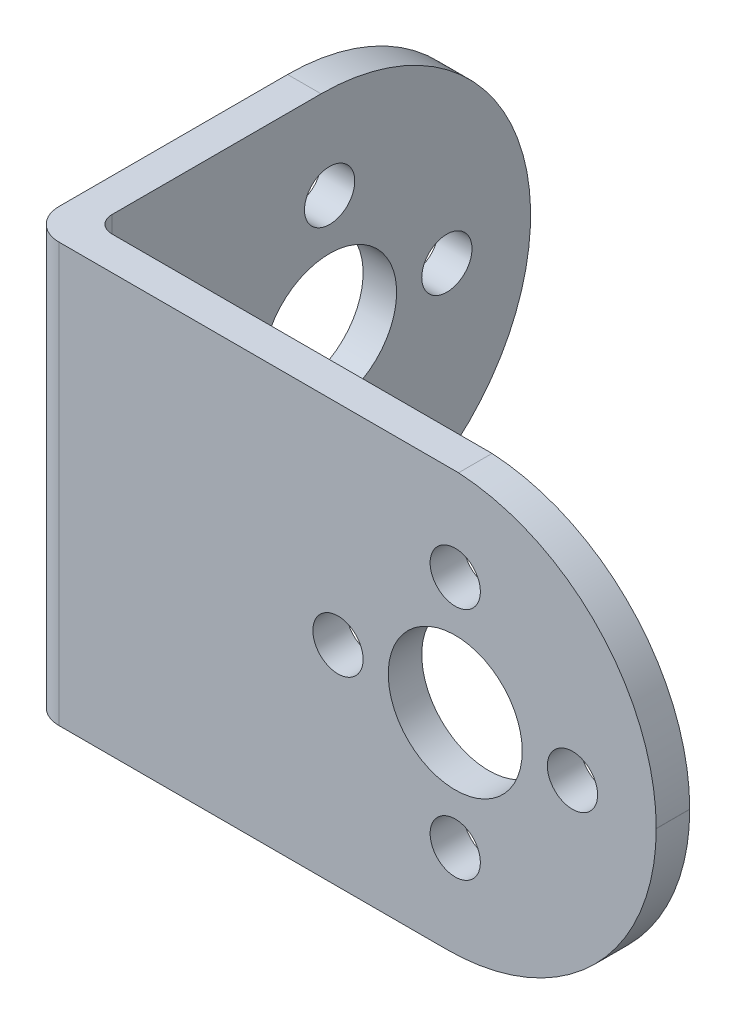
ISO-10303-21;
HEADER;
FILE_DESCRIPTION(('STEP AP214'),'2;1');
FILE_NAME('part.step','',(''),(''),'','','');
FILE_SCHEMA(('AUTOMOTIVE_DESIGN { 1 0 10303 214 1 1 1 1 }'));
ENDSEC;
DATA;
#1=APPLICATION_CONTEXT('core data for automotive mechanical design processes');
#2=APPLICATION_PROTOCOL_DEFINITION('international standard','automotive_design',2000,#1);
#3=PRODUCT_CONTEXT('',#1,'mechanical');
#4=PRODUCT('Part','Part','',(#3));
#5=PRODUCT_RELATED_PRODUCT_CATEGORY('part','',(#4));
#6=PRODUCT_DEFINITION_FORMATION('','',#4);
#7=PRODUCT_DEFINITION_CONTEXT('part definition',#1,'design');
#8=PRODUCT_DEFINITION('design','',#6,#7);
#9=PRODUCT_DEFINITION_SHAPE('','',#8);
#10=(LENGTH_UNIT() NAMED_UNIT(*) SI_UNIT(.MILLI.,.METRE.));
#11=(NAMED_UNIT(*) PLANE_ANGLE_UNIT() SI_UNIT($,.RADIAN.));
#12=(NAMED_UNIT(*) SI_UNIT($,.STERADIAN.) SOLID_ANGLE_UNIT());
#13=UNCERTAINTY_MEASURE_WITH_UNIT(LENGTH_MEASURE(1.E-05),#10,'distance_accuracy_value','');
#14=(GEOMETRIC_REPRESENTATION_CONTEXT(3) GLOBAL_UNCERTAINTY_ASSIGNED_CONTEXT((#13)) GLOBAL_UNIT_ASSIGNED_CONTEXT((#10,
#11,#12)) REPRESENTATION_CONTEXT('',''));
#15=CARTESIAN_POINT('',(0.,0.,0.));
#16=DIRECTION('',(0.,0.,1.));
#17=DIRECTION('',(1.,0.,0.));
#18=AXIS2_PLACEMENT_3D('',#15,#16,#17);
#19=CARTESIAN_POINT('',(37.5,25.,-2.));
#20=DIRECTION('',(-1.,0.,0.));
#21=DIRECTION('',(0.,0.,1.));
#22=AXIS2_PLACEMENT_3D('',#19,#20,#21);
#23=PLANE('',#22);
#24=CARTESIAN_POINT('',(37.4999960031981,12.5000000015974,-2.));
#25=DIRECTION('',(0.,0.,1.));
#26=VECTOR('',#25,1.);
#27=LINE('',#24,#26);
#28=CARTESIAN_POINT('',(37.499998001599,12.5000000007987,-2.));
#29=VERTEX_POINT('',#28);
#30=CARTESIAN_POINT('',(37.4999980015984,12.5,0.));
#31=VERTEX_POINT('',#30);
#32=EDGE_CURVE('E286',#29,#31,#27,.T.);
#33=ORIENTED_EDGE('',*,*,#32,.F.);
#34=DIRECTION('',(0.,-1.,0.));
#35=VECTOR('',#34,1.);
#36=CARTESIAN_POINT('',(37.5,25.,-2.));
#37=LINE('',#36,#35);
#38=CARTESIAN_POINT('',(37.5,12.51,-2.));
#39=VERTEX_POINT('',#38);
#40=EDGE_CURVE('E328',#39,#29,#37,.T.);
#41=ORIENTED_EDGE('',*,*,#40,.F.);
#42=DIRECTION('',(0.,0.,1.));
#43=VECTOR('',#42,1.);
#44=CARTESIAN_POINT('',(37.5,12.51,-25.));
#45=LINE('',#44,#43);
#46=CARTESIAN_POINT('',(37.5,12.51,0.));
#47=VERTEX_POINT('',#46);
#48=EDGE_CURVE('E224',#39,#47,#45,.T.);
#49=ORIENTED_EDGE('',*,*,#48,.T.);
#50=DIRECTION('',(0.,-1.,0.));
#51=VECTOR('',#50,1.);
#52=CARTESIAN_POINT('',(37.5,25.,0.));
#53=LINE('',#52,#51);
#54=EDGE_CURVE('E337',#47,#31,#53,.T.);
#55=ORIENTED_EDGE('',*,*,#54,.T.);
#56=EDGE_LOOP('',(#33,#41,#49,#55));
#57=FACE_BOUND('',#56,.T.);
#58=ADVANCED_FACE('F205',(#57),#23,.F.);
#59=CARTESIAN_POINT('',(3.,25.,-3.));
#60=DIRECTION('',(0.,1.,0.));
#61=DIRECTION('',(0.,0.,1.));
#62=AXIS2_PLACEMENT_3D('',#59,#60,#61);
#63=PLANE('',#62);
#64=DIRECTION('',(1.,0.,0.));
#65=VECTOR('',#64,1.);
#66=CARTESIAN_POINT('',(37.5,25.,0.));
#67=LINE('',#66,#65);
#68=CARTESIAN_POINT('',(1.84,25.,0.));
#69=VERTEX_POINT('',#68);
#70=CARTESIAN_POINT('',(25.6971067811866,25.,0.));
#71=VERTEX_POINT('',#70);
#72=EDGE_CURVE('E375',#69,#71,#67,.T.);
#73=ORIENTED_EDGE('',*,*,#72,.T.);
#74=DIRECTION('',(0.,0.,1.));
#75=VECTOR('',#74,1.);
#76=CARTESIAN_POINT('',(25.6971067811866,25.,-25.));
#77=LINE('',#76,#75);
#78=CARTESIAN_POINT('',(25.6971067811866,25.,-2.));
#79=VERTEX_POINT('',#78);
#80=EDGE_CURVE('E346',#79,#71,#77,.T.);
#81=ORIENTED_EDGE('',*,*,#80,.F.);
#82=DIRECTION('',(-1.,0.,0.));
#83=VECTOR('',#82,1.);
#84=CARTESIAN_POINT('',(3.00000000000001,25.,-2.));
#85=LINE('',#84,#83);
#86=CARTESIAN_POINT('',(3.00000000000001,25.,-2.));
#87=VERTEX_POINT('',#86);
#88=EDGE_CURVE('E368',#79,#87,#85,.T.);
#89=ORIENTED_EDGE('',*,*,#88,.T.);
#90=CARTESIAN_POINT('',(3.,25.,-3.));
#91=DIRECTION('',(0.,-1.,0.));
#92=DIRECTION('',(0.,0.,1.));
#93=AXIS2_PLACEMENT_3D('',#90,#91,#92);
#94=CIRCLE('',#93,1.);
#95=CARTESIAN_POINT('',(2.,25.,-3.00000000000001));
#96=VERTEX_POINT('',#95);
#97=EDGE_CURVE('E465',#87,#96,#94,.T.);
#98=ORIENTED_EDGE('',*,*,#97,.T.);
#99=DIRECTION('',(0.,0.,-1.));
#100=VECTOR('',#99,1.);
#101=CARTESIAN_POINT('',(2.,25.,-28.));
#102=LINE('',#101,#100);
#103=CARTESIAN_POINT('',(2.,25.,-15.49));
#104=VERTEX_POINT('',#103);
#105=EDGE_CURVE('E325',#96,#104,#102,.T.);
#106=ORIENTED_EDGE('',*,*,#105,.T.);
#107=DIRECTION('',(-1.,0.,0.));
#108=VECTOR('',#107,1.);
#109=CARTESIAN_POINT('',(25.,25.,-15.49));
#110=LINE('',#109,#108);
#111=CARTESIAN_POINT('',(0.,25.,-15.49));
#112=VERTEX_POINT('',#111);
#113=EDGE_CURVE('E499',#104,#112,#110,.T.);
#114=ORIENTED_EDGE('',*,*,#113,.T.);
#115=DIRECTION('',(0.,0.,1.));
#116=VECTOR('',#115,1.);
#117=CARTESIAN_POINT('',(0.,25.,-1.84000000000001));
#118=LINE('',#117,#116);
#119=CARTESIAN_POINT('',(0.,25.,-1.84000000000001));
#120=VERTEX_POINT('',#119);
#121=EDGE_CURVE('E320',#112,#120,#118,.T.);
#122=ORIENTED_EDGE('',*,*,#121,.T.);
#123=CARTESIAN_POINT('',(1.84,25.,-1.84));
#124=DIRECTION('',(0.,1.,0.));
#125=DIRECTION('',(0.,0.,1.));
#126=AXIS2_PLACEMENT_3D('',#123,#124,#125);
#127=CIRCLE('',#126,1.84);
#128=EDGE_CURVE('E469',#120,#69,#127,.T.);
#129=ORIENTED_EDGE('',*,*,#128,.T.);
#130=EDGE_LOOP('',(#73,#81,#89,#98,#106,#114,#122,#129));
#131=FACE_BOUND('',#130,.T.);
#132=ADVANCED_FACE('F374',(#131),#63,.T.);
#133=CARTESIAN_POINT('',(37.5,25.,0.));
#134=DIRECTION('',(0.,0.,-1.));
#135=DIRECTION('',(-1.,0.,0.));
#136=AXIS2_PLACEMENT_3D('',#133,#134,#135);
#137=PLANE('',#136);
#138=CARTESIAN_POINT('',(32.5,12.5,0.));
#139=DIRECTION('',(0.,0.,1.));
#140=DIRECTION('',(1.,0.,0.));
#141=AXIS2_PLACEMENT_3D('',#138,#139,#140);
#142=CIRCLE('',#141,1.5);
#143=CARTESIAN_POINT('',(34.,12.5,0.));
#144=VERTEX_POINT('',#143);
#145=EDGE_CURVE('E657',#144,#144,#142,.T.);
#146=ORIENTED_EDGE('',*,*,#145,.F.);
#147=EDGE_LOOP('',(#146));
#148=FACE_BOUND('',#147,.T.);
#149=CARTESIAN_POINT('',(25.5,12.5,0.));
#150=DIRECTION('',(0.,0.,1.));
#151=DIRECTION('',(1.,0.,0.));
#152=AXIS2_PLACEMENT_3D('',#149,#150,#151);
#153=CIRCLE('',#152,4.);
#154=CARTESIAN_POINT('',(29.5,12.5,0.));
#155=VERTEX_POINT('',#154);
#156=EDGE_CURVE('E671',#155,#155,#153,.T.);
#157=ORIENTED_EDGE('',*,*,#156,.F.);
#158=EDGE_LOOP('',(#157));
#159=FACE_BOUND('',#158,.T.);
#160=CARTESIAN_POINT('',(18.5,12.5,0.));
#161=DIRECTION('',(0.,0.,1.));
#162=DIRECTION('',(1.,0.,0.));
#163=AXIS2_PLACEMENT_3D('',#160,#161,#162);
#164=CIRCLE('',#163,1.5);
#165=CARTESIAN_POINT('',(20.,12.5,0.));
#166=VERTEX_POINT('',#165);
#167=EDGE_CURVE('E677',#166,#166,#164,.T.);
#168=ORIENTED_EDGE('',*,*,#167,.F.);
#169=EDGE_LOOP('',(#168));
#170=FACE_BOUND('',#169,.T.);
#171=CARTESIAN_POINT('',(25.5,19.5,0.));
#172=DIRECTION('',(0.,0.,1.));
#173=DIRECTION('',(1.,0.,0.));
#174=AXIS2_PLACEMENT_3D('',#171,#172,#173);
#175=CIRCLE('',#174,1.5);
#176=CARTESIAN_POINT('',(27.,19.5,0.));
#177=VERTEX_POINT('',#176);
#178=EDGE_CURVE('E672',#177,#177,#175,.T.);
#179=ORIENTED_EDGE('',*,*,#178,.F.);
#180=EDGE_LOOP('',(#179));
#181=FACE_BOUND('',#180,.T.);
#182=CARTESIAN_POINT('',(25.5,5.5,0.));
#183=DIRECTION('',(0.,0.,1.));
#184=DIRECTION('',(1.,0.,0.));
#185=AXIS2_PLACEMENT_3D('',#182,#183,#184);
#186=CIRCLE('',#185,1.5);
#187=CARTESIAN_POINT('',(27.,5.5,0.));
#188=VERTEX_POINT('',#187);
#189=EDGE_CURVE('E292',#188,#188,#186,.T.);
#190=ORIENTED_EDGE('',*,*,#189,.F.);
#191=EDGE_LOOP('',(#190));
#192=FACE_BOUND('',#191,.T.);
#193=CARTESIAN_POINT('',(24.99,12.51,0.));
#194=DIRECTION('',(0.,0.,1.));
#195=DIRECTION('',(1.,0.,0.));
#196=AXIS2_PLACEMENT_3D('',#193,#194,#195);
#197=CIRCLE('',#196,12.51);
#198=CARTESIAN_POINT('',(24.99,0.,0.));
#199=VERTEX_POINT('',#198);
#200=EDGE_CURVE('E283',#199,#31,#197,.T.);
#201=ORIENTED_EDGE('',*,*,#200,.T.);
#202=ORIENTED_EDGE('',*,*,#54,.F.);
#203=CARTESIAN_POINT('',(24.99,12.51,0.));
#204=DIRECTION('',(0.,0.,1.));
#205=DIRECTION('',(1.,0.,0.));
#206=AXIS2_PLACEMENT_3D('',#203,#204,#205);
#207=CIRCLE('',#206,12.51);
#208=EDGE_CURVE('E363',#47,#71,#207,.T.);
#209=ORIENTED_EDGE('',*,*,#208,.T.);
#210=ORIENTED_EDGE('',*,*,#72,.F.);
#211=DIRECTION('',(0.,-1.,0.));
#212=VECTOR('',#211,1.);
#213=CARTESIAN_POINT('',(1.84,25.,0.));
#214=LINE('',#213,#212);
#215=CARTESIAN_POINT('',(1.84,0.,0.));
#216=VERTEX_POINT('',#215);
#217=EDGE_CURVE('E307',#69,#216,#214,.T.);
#218=ORIENTED_EDGE('',*,*,#217,.T.);
#219=DIRECTION('',(1.,0.,0.));
#220=VECTOR('',#219,1.);
#221=CARTESIAN_POINT('',(37.5,0.,0.));
#222=LINE('',#221,#220);
#223=EDGE_CURVE('E299',#216,#199,#222,.T.);
#224=ORIENTED_EDGE('',*,*,#223,.T.);
#225=EDGE_LOOP('',(#201,#202,#209,#210,#218,#224));
#226=FACE_BOUND('',#225,.T.);
#227=ADVANCED_FACE('F304',(#148,#159,#170,#181,#192,#226),#137,.F.);
#228=CARTESIAN_POINT('',(3.00000000000001,25.,-2.));
#229=DIRECTION('',(0.,0.,1.));
#230=DIRECTION('',(1.,0.,0.));
#231=AXIS2_PLACEMENT_3D('',#228,#229,#230);
#232=PLANE('',#231);
#233=CARTESIAN_POINT('',(32.5,12.5,-2.00000000000001));
#234=DIRECTION('',(0.,0.,1.));
#235=DIRECTION('',(1.,0.,0.));
#236=AXIS2_PLACEMENT_3D('',#233,#234,#235);
#237=CIRCLE('',#236,1.5);
#238=CARTESIAN_POINT('',(34.,12.5,-2.00000000000001));
#239=VERTEX_POINT('',#238);
#240=EDGE_CURVE('E357',#239,#239,#237,.T.);
#241=ORIENTED_EDGE('',*,*,#240,.T.);
#242=EDGE_LOOP('',(#241));
#243=FACE_BOUND('',#242,.T.);
#244=CARTESIAN_POINT('',(25.5,12.5,-2.00000000000001));
#245=DIRECTION('',(0.,0.,1.));
#246=DIRECTION('',(1.,0.,0.));
#247=AXIS2_PLACEMENT_3D('',#244,#245,#246);
#248=CIRCLE('',#247,4.);
#249=CARTESIAN_POINT('',(29.5,12.5,-2.00000000000001));
#250=VERTEX_POINT('',#249);
#251=EDGE_CURVE('E351',#250,#250,#248,.T.);
#252=ORIENTED_EDGE('',*,*,#251,.T.);
#253=EDGE_LOOP('',(#252));
#254=FACE_BOUND('',#253,.T.);
#255=CARTESIAN_POINT('',(18.5,12.5,-2.));
#256=DIRECTION('',(0.,0.,1.));
#257=DIRECTION('',(1.,0.,0.));
#258=AXIS2_PLACEMENT_3D('',#255,#256,#257);
#259=CIRCLE('',#258,1.5);
#260=CARTESIAN_POINT('',(20.,12.5,-2.));
#261=VERTEX_POINT('',#260);
#262=EDGE_CURVE('E342',#261,#261,#259,.T.);
#263=ORIENTED_EDGE('',*,*,#262,.T.);
#264=EDGE_LOOP('',(#263));
#265=FACE_BOUND('',#264,.T.);
#266=CARTESIAN_POINT('',(25.5,19.5,-2.00000000000001));
#267=DIRECTION('',(0.,0.,1.));
#268=DIRECTION('',(1.,0.,0.));
#269=AXIS2_PLACEMENT_3D('',#266,#267,#268);
#270=CIRCLE('',#269,1.5);
#271=CARTESIAN_POINT('',(27.,19.5,-2.00000000000001));
#272=VERTEX_POINT('',#271);
#273=EDGE_CURVE('E345',#272,#272,#270,.T.);
#274=ORIENTED_EDGE('',*,*,#273,.T.);
#275=EDGE_LOOP('',(#274));
#276=FACE_BOUND('',#275,.T.);
#277=CARTESIAN_POINT('',(25.5,5.5,-2.00000000000001));
#278=DIRECTION('',(0.,0.,1.));
#279=DIRECTION('',(1.,0.,0.));
#280=AXIS2_PLACEMENT_3D('',#277,#278,#279);
#281=CIRCLE('',#280,1.5);
#282=CARTESIAN_POINT('',(27.,5.5,-2.00000000000001));
#283=VERTEX_POINT('',#282);
#284=EDGE_CURVE('E349',#283,#283,#281,.T.);
#285=ORIENTED_EDGE('',*,*,#284,.T.);
#286=EDGE_LOOP('',(#285));
#287=FACE_BOUND('',#286,.T.);
#288=CARTESIAN_POINT('',(24.99,12.51,-2.00000000000001));
#289=DIRECTION('',(0.,0.,1.));
#290=DIRECTION('',(1.,0.,0.));
#291=AXIS2_PLACEMENT_3D('',#288,#289,#290);
#292=CIRCLE('',#291,12.51);
#293=CARTESIAN_POINT('',(24.99,0.,-2.));
#294=VERTEX_POINT('',#293);
#295=EDGE_CURVE('E12',#294,#29,#292,.T.);
#296=ORIENTED_EDGE('',*,*,#295,.F.);
#297=DIRECTION('',(-1.,0.,0.));
#298=VECTOR('',#297,1.);
#299=CARTESIAN_POINT('',(3.00000000000001,0.,-2.));
#300=LINE('',#299,#298);
#301=CARTESIAN_POINT('',(3.00000000000001,0.,-2.));
#302=VERTEX_POINT('',#301);
#303=EDGE_CURVE('E301',#294,#302,#300,.T.);
#304=ORIENTED_EDGE('',*,*,#303,.T.);
#305=DIRECTION('',(0.,-1.,0.));
#306=VECTOR('',#305,1.);
#307=CARTESIAN_POINT('',(3.00000000000001,25.,-2.));
#308=LINE('',#307,#306);
#309=EDGE_CURVE('E324',#87,#302,#308,.T.);
#310=ORIENTED_EDGE('',*,*,#309,.F.);
#311=ORIENTED_EDGE('',*,*,#88,.F.);
#312=CARTESIAN_POINT('',(24.99,12.51,-2.00000000000001));
#313=DIRECTION('',(0.,0.,1.));
#314=DIRECTION('',(1.,0.,0.));
#315=AXIS2_PLACEMENT_3D('',#312,#313,#314);
#316=CIRCLE('',#315,12.51);
#317=EDGE_CURVE('E216',#39,#79,#316,.T.);
#318=ORIENTED_EDGE('',*,*,#317,.F.);
#319=ORIENTED_EDGE('',*,*,#40,.T.);
#320=EDGE_LOOP('',(#296,#304,#310,#311,#318,#319));
#321=FACE_BOUND('',#320,.T.);
#322=ADVANCED_FACE('F365',(#243,#254,#265,#276,#287,#321),#232,.F.);
#323=CARTESIAN_POINT('',(0.,25.,-1.84000000000001));
#324=DIRECTION('',(1.,0.,0.));
#325=DIRECTION('',(0.,0.,-1.));
#326=AXIS2_PLACEMENT_3D('',#323,#324,#325);
#327=PLANE('',#326);
#328=CARTESIAN_POINT('',(0.,19.49,-16.));
#329=DIRECTION('',(-1.,0.,0.));
#330=DIRECTION('',(0.,0.,1.));
#331=AXIS2_PLACEMENT_3D('',#328,#329,#330);
#332=CIRCLE('',#331,1.5);
#333=CARTESIAN_POINT('',(0.,19.49,-14.5));
#334=VERTEX_POINT('',#333);
#335=EDGE_CURVE('E360',#334,#334,#332,.T.);
#336=ORIENTED_EDGE('',*,*,#335,.F.);
#337=EDGE_LOOP('',(#336));
#338=FACE_BOUND('',#337,.T.);
#339=CARTESIAN_POINT('',(0.,12.49,-9.));
#340=DIRECTION('',(-1.,0.,0.));
#341=DIRECTION('',(0.,0.,1.));
#342=AXIS2_PLACEMENT_3D('',#339,#340,#341);
#343=CIRCLE('',#342,1.5);
#344=CARTESIAN_POINT('',(0.,12.49,-7.5));
#345=VERTEX_POINT('',#344);
#346=EDGE_CURVE('E381',#345,#345,#343,.T.);
#347=ORIENTED_EDGE('',*,*,#346,.F.);
#348=EDGE_LOOP('',(#347));
#349=FACE_BOUND('',#348,.T.);
#350=CARTESIAN_POINT('',(0.,12.49,-16.));
#351=DIRECTION('',(-1.,0.,0.));
#352=DIRECTION('',(0.,0.,1.));
#353=AXIS2_PLACEMENT_3D('',#350,#351,#352);
#354=CIRCLE('',#353,4.);
#355=CARTESIAN_POINT('',(0.,12.49,-12.));
#356=VERTEX_POINT('',#355);
#357=EDGE_CURVE('E473',#356,#356,#354,.T.);
#358=ORIENTED_EDGE('',*,*,#357,.F.);
#359=EDGE_LOOP('',(#358));
#360=FACE_BOUND('',#359,.T.);
#361=CARTESIAN_POINT('',(0.,5.49,-16.));
#362=DIRECTION('',(-1.,0.,0.));
#363=DIRECTION('',(0.,0.,1.));
#364=AXIS2_PLACEMENT_3D('',#361,#362,#363);
#365=CIRCLE('',#364,1.5);
#366=CARTESIAN_POINT('',(0.,5.49,-14.5));
#367=VERTEX_POINT('',#366);
#368=EDGE_CURVE('E478',#367,#367,#365,.T.);
#369=ORIENTED_EDGE('',*,*,#368,.F.);
#370=EDGE_LOOP('',(#369));
#371=FACE_BOUND('',#370,.T.);
#372=CARTESIAN_POINT('',(0.,12.49,-23.));
#373=DIRECTION('',(-1.,0.,0.));
#374=DIRECTION('',(0.,0.,1.));
#375=AXIS2_PLACEMENT_3D('',#372,#373,#374);
#376=CIRCLE('',#375,1.5);
#377=CARTESIAN_POINT('',(0.,12.49,-21.5));
#378=VERTEX_POINT('',#377);
#379=EDGE_CURVE('E477',#378,#378,#376,.T.);
#380=ORIENTED_EDGE('',*,*,#379,.F.);
#381=EDGE_LOOP('',(#380));
#382=FACE_BOUND('',#381,.T.);
#383=CARTESIAN_POINT('',(0.,12.49,-15.49));
#384=DIRECTION('',(-1.,0.,0.));
#385=DIRECTION('',(0.,0.,1.));
#386=AXIS2_PLACEMENT_3D('',#383,#384,#385);
#387=CIRCLE('',#386,12.51);
#388=CARTESIAN_POINT('',(0.,0.,-16.1971067811865));
#389=VERTEX_POINT('',#388);
#390=EDGE_CURVE('E460',#112,#389,#387,.T.);
#391=ORIENTED_EDGE('',*,*,#390,.T.);
#392=DIRECTION('',(0.,0.,1.));
#393=VECTOR('',#392,1.);
#394=CARTESIAN_POINT('',(0.,0.,-1.84000000000001));
#395=LINE('',#394,#393);
#396=CARTESIAN_POINT('',(0.,0.,-1.84000000000001));
#397=VERTEX_POINT('',#396);
#398=EDGE_CURVE('E312',#389,#397,#395,.T.);
#399=ORIENTED_EDGE('',*,*,#398,.T.);
#400=DIRECTION('',(0.,-1.,0.));
#401=VECTOR('',#400,1.);
#402=CARTESIAN_POINT('',(0.,25.,-1.84000000000001));
#403=LINE('',#402,#401);
#404=EDGE_CURVE('E453',#120,#397,#403,.T.);
#405=ORIENTED_EDGE('',*,*,#404,.F.);
#406=ORIENTED_EDGE('',*,*,#121,.F.);
#407=EDGE_LOOP('',(#391,#399,#405,#406));
#408=FACE_BOUND('',#407,.T.);
#409=ADVANCED_FACE('F207',(#338,#349,#360,#371,#382,#408),#327,.F.);
#410=CARTESIAN_POINT('',(2.,25.,-28.));
#411=DIRECTION('',(-1.,0.,0.));
#412=DIRECTION('',(0.,0.,1.));
#413=AXIS2_PLACEMENT_3D('',#410,#411,#412);
#414=PLANE('',#413);
#415=CARTESIAN_POINT('',(2.,19.49,-16.));
#416=DIRECTION('',(-1.,0.,0.));
#417=DIRECTION('',(0.,0.,1.));
#418=AXIS2_PLACEMENT_3D('',#415,#416,#417);
#419=CIRCLE('',#418,1.5);
#420=CARTESIAN_POINT('',(2.,19.49,-14.5));
#421=VERTEX_POINT('',#420);
#422=EDGE_CURVE('E338',#421,#421,#419,.T.);
#423=ORIENTED_EDGE('',*,*,#422,.T.);
#424=EDGE_LOOP('',(#423));
#425=FACE_BOUND('',#424,.T.);
#426=CARTESIAN_POINT('',(2.,12.49,-9.));
#427=DIRECTION('',(-1.,0.,0.));
#428=DIRECTION('',(0.,0.,1.));
#429=AXIS2_PLACEMENT_3D('',#426,#427,#428);
#430=CIRCLE('',#429,1.5);
#431=CARTESIAN_POINT('',(2.,12.49,-7.5));
#432=VERTEX_POINT('',#431);
#433=EDGE_CURVE('E511',#432,#432,#430,.T.);
#434=ORIENTED_EDGE('',*,*,#433,.T.);
#435=EDGE_LOOP('',(#434));
#436=FACE_BOUND('',#435,.T.);
#437=CARTESIAN_POINT('',(2.,12.49,-16.));
#438=DIRECTION('',(-1.,0.,0.));
#439=DIRECTION('',(0.,0.,1.));
#440=AXIS2_PLACEMENT_3D('',#437,#438,#439);
#441=CIRCLE('',#440,4.);
#442=CARTESIAN_POINT('',(2.,12.49,-12.));
#443=VERTEX_POINT('',#442);
#444=EDGE_CURVE('E509',#443,#443,#441,.T.);
#445=ORIENTED_EDGE('',*,*,#444,.T.);
#446=EDGE_LOOP('',(#445));
#447=FACE_BOUND('',#446,.T.);
#448=CARTESIAN_POINT('',(2.,5.49,-16.));
#449=DIRECTION('',(-1.,0.,0.));
#450=DIRECTION('',(0.,0.,1.));
#451=AXIS2_PLACEMENT_3D('',#448,#449,#450);
#452=CIRCLE('',#451,1.5);
#453=CARTESIAN_POINT('',(2.,5.49,-14.5));
#454=VERTEX_POINT('',#453);
#455=EDGE_CURVE('E476',#454,#454,#452,.T.);
#456=ORIENTED_EDGE('',*,*,#455,.T.);
#457=EDGE_LOOP('',(#456));
#458=FACE_BOUND('',#457,.T.);
#459=CARTESIAN_POINT('',(2.,12.49,-23.));
#460=DIRECTION('',(-1.,0.,0.));
#461=DIRECTION('',(0.,0.,1.));
#462=AXIS2_PLACEMENT_3D('',#459,#460,#461);
#463=CIRCLE('',#462,1.5);
#464=CARTESIAN_POINT('',(2.,12.49,-21.5));
#465=VERTEX_POINT('',#464);
#466=EDGE_CURVE('E506',#465,#465,#463,.T.);
#467=ORIENTED_EDGE('',*,*,#466,.T.);
#468=EDGE_LOOP('',(#467));
#469=FACE_BOUND('',#468,.T.);
#470=DIRECTION('',(0.,0.,-1.));
#471=VECTOR('',#470,1.);
#472=CARTESIAN_POINT('',(2.,0.,-28.));
#473=LINE('',#472,#471);
#474=CARTESIAN_POINT('',(2.,0.,-3.00000000000001));
#475=VERTEX_POINT('',#474);
#476=CARTESIAN_POINT('',(2.,0.,-16.1971067811865));
#477=VERTEX_POINT('',#476);
#478=EDGE_CURVE('E317',#475,#477,#473,.T.);
#479=ORIENTED_EDGE('',*,*,#478,.T.);
#480=CARTESIAN_POINT('',(2.,12.49,-15.49));
#481=DIRECTION('',(-1.,0.,0.));
#482=DIRECTION('',(0.,0.,1.));
#483=AXIS2_PLACEMENT_3D('',#480,#481,#482);
#484=CIRCLE('',#483,12.51);
#485=EDGE_CURVE('E459',#104,#477,#484,.T.);
#486=ORIENTED_EDGE('',*,*,#485,.F.);
#487=ORIENTED_EDGE('',*,*,#105,.F.);
#488=DIRECTION('',(0.,-1.,0.));
#489=VECTOR('',#488,1.);
#490=CARTESIAN_POINT('',(2.,25.,-3.00000000000001));
#491=LINE('',#490,#489);
#492=EDGE_CURVE('E321',#96,#475,#491,.T.);
#493=ORIENTED_EDGE('',*,*,#492,.T.);
#494=EDGE_LOOP('',(#479,#486,#487,#493));
#495=FACE_BOUND('',#494,.T.);
#496=ADVANCED_FACE('F432',(#425,#436,#447,#458,#469,#495),#414,.F.);
#497=CARTESIAN_POINT('',(3.,0.,-3.));
#498=DIRECTION('',(0.,1.,0.));
#499=DIRECTION('',(0.,0.,1.));
#500=AXIS2_PLACEMENT_3D('',#497,#498,#499);
#501=PLANE('',#500);
#502=ORIENTED_EDGE('',*,*,#303,.F.);
#503=DIRECTION('',(0.,0.,1.));
#504=VECTOR('',#503,1.);
#505=CARTESIAN_POINT('',(24.99,0.,-25.));
#506=LINE('',#505,#504);
#507=EDGE_CURVE('E231',#294,#199,#506,.T.);
#508=ORIENTED_EDGE('',*,*,#507,.T.);
#509=ORIENTED_EDGE('',*,*,#223,.F.);
#510=CARTESIAN_POINT('',(1.84,0.,-1.84));
#511=DIRECTION('',(0.,1.,0.));
#512=DIRECTION('',(0.,0.,1.));
#513=AXIS2_PLACEMENT_3D('',#510,#511,#512);
#514=CIRCLE('',#513,1.84);
#515=EDGE_CURVE('E308',#397,#216,#514,.T.);
#516=ORIENTED_EDGE('',*,*,#515,.F.);
#517=ORIENTED_EDGE('',*,*,#398,.F.);
#518=DIRECTION('',(-1.,0.,0.));
#519=VECTOR('',#518,1.);
#520=CARTESIAN_POINT('',(25.,0.,-16.1971067811865));
#521=LINE('',#520,#519);
#522=EDGE_CURVE('E341',#477,#389,#521,.T.);
#523=ORIENTED_EDGE('',*,*,#522,.F.);
#524=ORIENTED_EDGE('',*,*,#478,.F.);
#525=CARTESIAN_POINT('',(3.,0.,-3.));
#526=DIRECTION('',(0.,-1.,0.));
#527=DIRECTION('',(0.,0.,1.));
#528=AXIS2_PLACEMENT_3D('',#525,#526,#527);
#529=CIRCLE('',#528,1.);
#530=EDGE_CURVE('E310',#302,#475,#529,.T.);
#531=ORIENTED_EDGE('',*,*,#530,.F.);
#532=EDGE_LOOP('',(#502,#508,#509,#516,#517,#523,#524,#531));
#533=FACE_BOUND('',#532,.T.);
#534=ADVANCED_FACE('F297',(#533),#501,.F.);
#535=CARTESIAN_POINT('',(1.84,25.,-1.84));
#536=DIRECTION('',(0.,-1.,0.));
#537=DIRECTION('',(0.,0.,-1.));
#538=AXIS2_PLACEMENT_3D('',#535,#536,#537);
#539=CYLINDRICAL_SURFACE('',#538,1.84);
#540=ORIENTED_EDGE('',*,*,#515,.T.);
#541=ORIENTED_EDGE('',*,*,#217,.F.);
#542=ORIENTED_EDGE('',*,*,#128,.F.);
#543=ORIENTED_EDGE('',*,*,#404,.T.);
#544=EDGE_LOOP('',(#540,#541,#542,#543));
#545=FACE_BOUND('',#544,.T.);
#546=ADVANCED_FACE('F431',(#545),#539,.T.);
#547=CARTESIAN_POINT('',(3.,25.,-3.));
#548=DIRECTION('',(0.,-1.,0.));
#549=DIRECTION('',(0.,0.,-1.));
#550=AXIS2_PLACEMENT_3D('',#547,#548,#549);
#551=CYLINDRICAL_SURFACE('',#550,1.);
#552=ORIENTED_EDGE('',*,*,#530,.T.);
#553=ORIENTED_EDGE('',*,*,#492,.F.);
#554=ORIENTED_EDGE('',*,*,#97,.F.);
#555=ORIENTED_EDGE('',*,*,#309,.T.);
#556=EDGE_LOOP('',(#552,#553,#554,#555));
#557=FACE_BOUND('',#556,.T.);
#558=ADVANCED_FACE('F425',(#557),#551,.F.);
#559=CARTESIAN_POINT('',(25.,12.49,-15.49));
#560=DIRECTION('',(-1.,0.,0.));
#561=DIRECTION('',(0.,0.,1.));
#562=AXIS2_PLACEMENT_3D('',#559,#560,#561);
#563=CYLINDRICAL_SURFACE('',#562,12.51);
#564=ORIENTED_EDGE('',*,*,#485,.T.);
#565=ORIENTED_EDGE('',*,*,#522,.T.);
#566=ORIENTED_EDGE('',*,*,#390,.F.);
#567=ORIENTED_EDGE('',*,*,#113,.F.);
#568=EDGE_LOOP('',(#564,#565,#566,#567));
#569=FACE_BOUND('',#568,.T.);
#570=ADVANCED_FACE('F418',(#569),#563,.T.);
#571=CARTESIAN_POINT('',(25.,5.49,-16.));
#572=DIRECTION('',(-1.,0.,0.));
#573=DIRECTION('',(0.,0.,1.));
#574=AXIS2_PLACEMENT_3D('',#571,#572,#573);
#575=CYLINDRICAL_SURFACE('',#574,1.5);
#576=ORIENTED_EDGE('',*,*,#368,.T.);
#577=EDGE_LOOP('',(#576));
#578=FACE_BOUND('',#577,.T.);
#579=ORIENTED_EDGE('',*,*,#455,.F.);
#580=EDGE_LOOP('',(#579));
#581=FACE_BOUND('',#580,.T.);
#582=ADVANCED_FACE('F414',(#578,#581),#575,.F.);
#583=CARTESIAN_POINT('',(25.,12.49,-23.));
#584=DIRECTION('',(-1.,0.,0.));
#585=DIRECTION('',(0.,0.,1.));
#586=AXIS2_PLACEMENT_3D('',#583,#584,#585);
#587=CYLINDRICAL_SURFACE('',#586,1.5);
#588=ORIENTED_EDGE('',*,*,#379,.T.);
#589=EDGE_LOOP('',(#588));
#590=FACE_BOUND('',#589,.T.);
#591=ORIENTED_EDGE('',*,*,#466,.F.);
#592=EDGE_LOOP('',(#591));
#593=FACE_BOUND('',#592,.T.);
#594=ADVANCED_FACE('F411',(#590,#593),#587,.F.);
#595=CARTESIAN_POINT('',(25.,12.49,-16.));
#596=DIRECTION('',(-1.,0.,0.));
#597=DIRECTION('',(0.,0.,1.));
#598=AXIS2_PLACEMENT_3D('',#595,#596,#597);
#599=CYLINDRICAL_SURFACE('',#598,4.);
#600=ORIENTED_EDGE('',*,*,#357,.T.);
#601=EDGE_LOOP('',(#600));
#602=FACE_BOUND('',#601,.T.);
#603=ORIENTED_EDGE('',*,*,#444,.F.);
#604=EDGE_LOOP('',(#603));
#605=FACE_BOUND('',#604,.T.);
#606=ADVANCED_FACE('F406',(#602,#605),#599,.F.);
#607=CARTESIAN_POINT('',(25.,12.49,-9.));
#608=DIRECTION('',(-1.,0.,0.));
#609=DIRECTION('',(0.,0.,1.));
#610=AXIS2_PLACEMENT_3D('',#607,#608,#609);
#611=CYLINDRICAL_SURFACE('',#610,1.5);
#612=ORIENTED_EDGE('',*,*,#346,.T.);
#613=EDGE_LOOP('',(#612));
#614=FACE_BOUND('',#613,.T.);
#615=ORIENTED_EDGE('',*,*,#433,.F.);
#616=EDGE_LOOP('',(#615));
#617=FACE_BOUND('',#616,.T.);
#618=ADVANCED_FACE('F403',(#614,#617),#611,.F.);
#619=CARTESIAN_POINT('',(25.,19.49,-16.));
#620=DIRECTION('',(-1.,0.,0.));
#621=DIRECTION('',(0.,0.,1.));
#622=AXIS2_PLACEMENT_3D('',#619,#620,#621);
#623=CYLINDRICAL_SURFACE('',#622,1.5);
#624=ORIENTED_EDGE('',*,*,#335,.T.);
#625=EDGE_LOOP('',(#624));
#626=FACE_BOUND('',#625,.T.);
#627=ORIENTED_EDGE('',*,*,#422,.F.);
#628=EDGE_LOOP('',(#627));
#629=FACE_BOUND('',#628,.T.);
#630=ADVANCED_FACE('F402',(#626,#629),#623,.F.);
#631=CARTESIAN_POINT('',(24.99,12.51,-25.));
#632=DIRECTION('',(0.,0.,1.));
#633=DIRECTION('',(1.,0.,0.));
#634=AXIS2_PLACEMENT_3D('',#631,#632,#633);
#635=CYLINDRICAL_SURFACE('',#634,12.51);
#636=ORIENTED_EDGE('',*,*,#317,.T.);
#637=ORIENTED_EDGE('',*,*,#80,.T.);
#638=ORIENTED_EDGE('',*,*,#208,.F.);
#639=ORIENTED_EDGE('',*,*,#48,.F.);
#640=EDGE_LOOP('',(#636,#637,#638,#639));
#641=FACE_BOUND('',#640,.T.);
#642=ADVANCED_FACE('F370',(#641),#635,.T.);
#643=CARTESIAN_POINT('',(18.5,12.5,-25.));
#644=DIRECTION('',(0.,0.,1.));
#645=DIRECTION('',(1.,0.,0.));
#646=AXIS2_PLACEMENT_3D('',#643,#644,#645);
#647=CYLINDRICAL_SURFACE('',#646,1.5);
#648=ORIENTED_EDGE('',*,*,#167,.T.);
#649=EDGE_LOOP('',(#648));
#650=FACE_BOUND('',#649,.T.);
#651=ORIENTED_EDGE('',*,*,#262,.F.);
#652=EDGE_LOOP('',(#651));
#653=FACE_BOUND('',#652,.T.);
#654=ADVANCED_FACE('F401',(#650,#653),#647,.F.);
#655=CARTESIAN_POINT('',(25.5,19.5,-25.));
#656=DIRECTION('',(0.,0.,1.));
#657=DIRECTION('',(1.,0.,0.));
#658=AXIS2_PLACEMENT_3D('',#655,#656,#657);
#659=CYLINDRICAL_SURFACE('',#658,1.5);
#660=ORIENTED_EDGE('',*,*,#178,.T.);
#661=EDGE_LOOP('',(#660));
#662=FACE_BOUND('',#661,.T.);
#663=ORIENTED_EDGE('',*,*,#273,.F.);
#664=EDGE_LOOP('',(#663));
#665=FACE_BOUND('',#664,.T.);
#666=ADVANCED_FACE('F606',(#662,#665),#659,.F.);
#667=CARTESIAN_POINT('',(25.5,5.5,-25.));
#668=DIRECTION('',(0.,0.,1.));
#669=DIRECTION('',(1.,0.,0.));
#670=AXIS2_PLACEMENT_3D('',#667,#668,#669);
#671=CYLINDRICAL_SURFACE('',#670,1.5);
#672=ORIENTED_EDGE('',*,*,#189,.T.);
#673=EDGE_LOOP('',(#672));
#674=FACE_BOUND('',#673,.T.);
#675=ORIENTED_EDGE('',*,*,#284,.F.);
#676=EDGE_LOOP('',(#675));
#677=FACE_BOUND('',#676,.T.);
#678=ADVANCED_FACE('F397',(#674,#677),#671,.F.);
#679=CARTESIAN_POINT('',(24.99,12.51,-25.));
#680=DIRECTION('',(0.,0.,1.));
#681=DIRECTION('',(1.,0.,0.));
#682=AXIS2_PLACEMENT_3D('',#679,#680,#681);
#683=CYLINDRICAL_SURFACE('',#682,12.51);
#684=ORIENTED_EDGE('',*,*,#295,.T.);
#685=ORIENTED_EDGE('',*,*,#32,.T.);
#686=ORIENTED_EDGE('',*,*,#200,.F.);
#687=ORIENTED_EDGE('',*,*,#507,.F.);
#688=EDGE_LOOP('',(#684,#685,#686,#687));
#689=FACE_BOUND('',#688,.T.);
#690=ADVANCED_FACE('F284',(#689),#683,.T.);
#691=CARTESIAN_POINT('',(25.5,12.5,-25.));
#692=DIRECTION('',(0.,0.,1.));
#693=DIRECTION('',(1.,0.,0.));
#694=AXIS2_PLACEMENT_3D('',#691,#692,#693);
#695=CYLINDRICAL_SURFACE('',#694,4.);
#696=ORIENTED_EDGE('',*,*,#156,.T.);
#697=EDGE_LOOP('',(#696));
#698=FACE_BOUND('',#697,.T.);
#699=ORIENTED_EDGE('',*,*,#251,.F.);
#700=EDGE_LOOP('',(#699));
#701=FACE_BOUND('',#700,.T.);
#702=ADVANCED_FACE('F396',(#698,#701),#695,.F.);
#703=CARTESIAN_POINT('',(32.5,12.5,-25.));
#704=DIRECTION('',(0.,0.,1.));
#705=DIRECTION('',(1.,0.,0.));
#706=AXIS2_PLACEMENT_3D('',#703,#704,#705);
#707=CYLINDRICAL_SURFACE('',#706,1.5);
#708=ORIENTED_EDGE('',*,*,#145,.T.);
#709=EDGE_LOOP('',(#708));
#710=FACE_BOUND('',#709,.T.);
#711=ORIENTED_EDGE('',*,*,#240,.F.);
#712=EDGE_LOOP('',(#711));
#713=FACE_BOUND('',#712,.T.);
#714=ADVANCED_FACE('F635',(#710,#713),#707,.F.);
#715=CLOSED_SHELL('',(#58,#132,#227,#322,#409,#496,#534,#546,#558,#570,#582,#594,#606,#618,#630,
#642,#654,#666,#678,#690,#702,#714));
#716=MANIFOLD_SOLID_BREP('B2',#715);
#717=ADVANCED_BREP_SHAPE_REPRESENTATION('',(#18,#716),#14);
#718=SHAPE_DEFINITION_REPRESENTATION(#9,#717);
ENDSEC;
END-ISO-10303-21;
